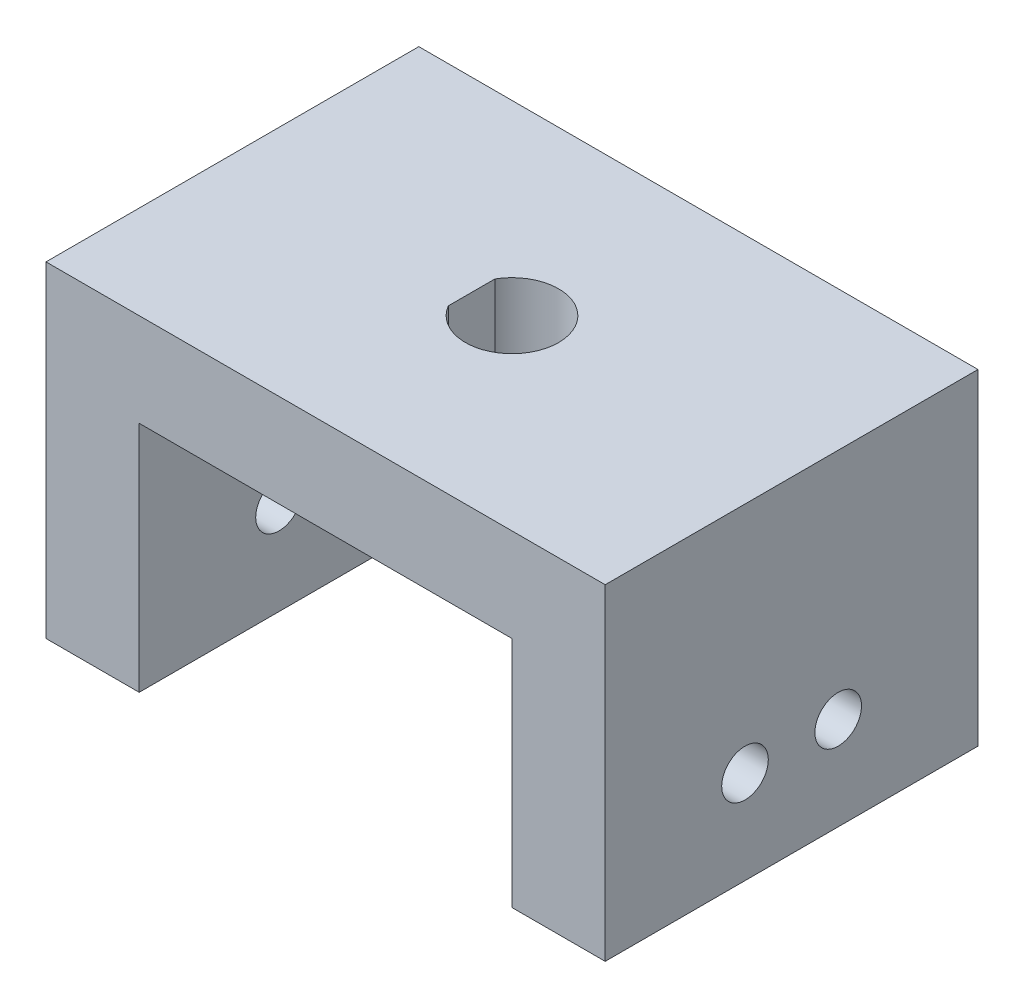
ISO-10303-21;
HEADER;
FILE_DESCRIPTION(('STEP AP214'),'2;1');
FILE_NAME('part.step','',(''),(''),'','','');
FILE_SCHEMA(('AUTOMOTIVE_DESIGN { 1 0 10303 214 1 1 1 1 }'));
ENDSEC;
DATA;
#1=APPLICATION_CONTEXT('core data for automotive mechanical design processes');
#2=APPLICATION_PROTOCOL_DEFINITION('international standard','automotive_design',2000,#1);
#3=PRODUCT_CONTEXT('',#1,'mechanical');
#4=PRODUCT('Part','Part','',(#3));
#5=PRODUCT_RELATED_PRODUCT_CATEGORY('part','',(#4));
#6=PRODUCT_DEFINITION_FORMATION('','',#4);
#7=PRODUCT_DEFINITION_CONTEXT('part definition',#1,'design');
#8=PRODUCT_DEFINITION('design','',#6,#7);
#9=PRODUCT_DEFINITION_SHAPE('','',#8);
#10=(LENGTH_UNIT() NAMED_UNIT(*) SI_UNIT(.MILLI.,.METRE.));
#11=(NAMED_UNIT(*) PLANE_ANGLE_UNIT() SI_UNIT($,.RADIAN.));
#12=(NAMED_UNIT(*) SI_UNIT($,.STERADIAN.) SOLID_ANGLE_UNIT());
#13=UNCERTAINTY_MEASURE_WITH_UNIT(LENGTH_MEASURE(1.E-05),#10,'distance_accuracy_value','');
#14=(GEOMETRIC_REPRESENTATION_CONTEXT(3) GLOBAL_UNCERTAINTY_ASSIGNED_CONTEXT((#13)) GLOBAL_UNIT_ASSIGNED_CONTEXT((#10,
#11,#12)) REPRESENTATION_CONTEXT('',''));
#15=CARTESIAN_POINT('',(0.,0.,0.));
#16=DIRECTION('',(0.,0.,1.));
#17=DIRECTION('',(1.,0.,0.));
#18=AXIS2_PLACEMENT_3D('',#15,#16,#17);
#19=CARTESIAN_POINT('',(-38.1,0.,50.8));
#20=DIRECTION('',(1.,0.,0.));
#21=DIRECTION('',(0.,1.,0.));
#22=AXIS2_PLACEMENT_3D('',#19,#20,#21);
#23=PLANE('',#22);
#24=CARTESIAN_POINT('',(-38.1,-31.75,19.05));
#25=DIRECTION('',(-1.,0.,0.));
#26=DIRECTION('',(0.,-1.,0.));
#27=AXIS2_PLACEMENT_3D('',#24,#25,#26);
#28=CIRCLE('',#27,3.175);
#29=CARTESIAN_POINT('',(-38.1,-34.925,19.05));
#30=VERTEX_POINT('',#29);
#31=EDGE_CURVE('E227',#30,#30,#28,.T.);
#32=ORIENTED_EDGE('',*,*,#31,.F.);
#33=EDGE_LOOP('',(#32));
#34=FACE_BOUND('',#33,.T.);
#35=CARTESIAN_POINT('',(-38.1,-31.75,31.75));
#36=DIRECTION('',(-1.,0.,0.));
#37=DIRECTION('',(0.,-1.,0.));
#38=AXIS2_PLACEMENT_3D('',#35,#36,#37);
#39=CIRCLE('',#38,3.175);
#40=CARTESIAN_POINT('',(-38.1,-34.925,31.75));
#41=VERTEX_POINT('',#40);
#42=EDGE_CURVE('E236',#41,#41,#39,.T.);
#43=ORIENTED_EDGE('',*,*,#42,.F.);
#44=EDGE_LOOP('',(#43));
#45=FACE_BOUND('',#44,.T.);
#46=DIRECTION('',(0.,-1.,0.));
#47=VECTOR('',#46,1.);
#48=CARTESIAN_POINT('',(-38.1,0.,0.));
#49=LINE('',#48,#47);
#50=CARTESIAN_POINT('',(-38.1,0.,0.));
#51=VERTEX_POINT('',#50);
#52=CARTESIAN_POINT('',(-38.1,-44.45,0.));
#53=VERTEX_POINT('',#52);
#54=EDGE_CURVE('E129',#51,#53,#49,.T.);
#55=ORIENTED_EDGE('',*,*,#54,.T.);
#56=DIRECTION('',(0.,0.,-1.));
#57=VECTOR('',#56,1.);
#58=CARTESIAN_POINT('',(-38.1,-44.45,50.8));
#59=LINE('',#58,#57);
#60=CARTESIAN_POINT('',(-38.1,-44.45,50.8));
#61=VERTEX_POINT('',#60);
#62=EDGE_CURVE('E11',#61,#53,#59,.T.);
#63=ORIENTED_EDGE('',*,*,#62,.F.);
#64=DIRECTION('',(0.,-1.,0.));
#65=VECTOR('',#64,1.);
#66=CARTESIAN_POINT('',(-38.1,0.,50.8));
#67=LINE('',#66,#65);
#68=CARTESIAN_POINT('',(-38.1,0.,50.8));
#69=VERTEX_POINT('',#68);
#70=EDGE_CURVE('E148',#69,#61,#67,.T.);
#71=ORIENTED_EDGE('',*,*,#70,.F.);
#72=DIRECTION('',(0.,0.,-1.));
#73=VECTOR('',#72,1.);
#74=CARTESIAN_POINT('',(-38.1,0.,50.8));
#75=LINE('',#74,#73);
#76=EDGE_CURVE('E174',#69,#51,#75,.T.);
#77=ORIENTED_EDGE('',*,*,#76,.T.);
#78=EDGE_LOOP('',(#55,#63,#71,#77));
#79=FACE_BOUND('',#78,.T.);
#80=ADVANCED_FACE('F39',(#34,#45,#79),#23,.F.);
#81=CARTESIAN_POINT('',(-38.1,-44.45,50.8));
#82=DIRECTION('',(0.,1.,0.));
#83=DIRECTION('',(0.,0.,1.));
#84=AXIS2_PLACEMENT_3D('',#81,#82,#83);
#85=PLANE('',#84);
#86=DIRECTION('',(1.,0.,0.));
#87=VECTOR('',#86,1.);
#88=CARTESIAN_POINT('',(-38.1,-44.45,0.));
#89=LINE('',#88,#87);
#90=CARTESIAN_POINT('',(-25.4,-44.45,0.));
#91=VERTEX_POINT('',#90);
#92=EDGE_CURVE('E178',#53,#91,#89,.T.);
#93=ORIENTED_EDGE('',*,*,#92,.T.);
#94=DIRECTION('',(0.,0.,-1.));
#95=VECTOR('',#94,1.);
#96=CARTESIAN_POINT('',(-25.4,-44.45,50.8));
#97=LINE('',#96,#95);
#98=CARTESIAN_POINT('',(-25.4,-44.45,50.8));
#99=VERTEX_POINT('',#98);
#100=EDGE_CURVE('E48',#99,#91,#97,.T.);
#101=ORIENTED_EDGE('',*,*,#100,.F.);
#102=DIRECTION('',(1.,0.,0.));
#103=VECTOR('',#102,1.);
#104=CARTESIAN_POINT('',(-38.1,-44.45,50.8));
#105=LINE('',#104,#103);
#106=EDGE_CURVE('E152',#61,#99,#105,.T.);
#107=ORIENTED_EDGE('',*,*,#106,.F.);
#108=ORIENTED_EDGE('',*,*,#62,.T.);
#109=EDGE_LOOP('',(#93,#101,#107,#108));
#110=FACE_BOUND('',#109,.T.);
#111=ADVANCED_FACE('F272',(#110),#85,.F.);
#112=CARTESIAN_POINT('',(-25.4,-44.45,50.8));
#113=DIRECTION('',(-1.,0.,0.));
#114=DIRECTION('',(0.,0.,1.));
#115=AXIS2_PLACEMENT_3D('',#112,#113,#114);
#116=PLANE('',#115);
#117=CARTESIAN_POINT('',(-25.4,-31.75,19.05));
#118=DIRECTION('',(-1.,0.,0.));
#119=DIRECTION('',(0.,0.,1.));
#120=AXIS2_PLACEMENT_3D('',#117,#118,#119);
#121=CIRCLE('',#120,3.175);
#122=CARTESIAN_POINT('',(-25.4,-31.75,22.225));
#123=VERTEX_POINT('',#122);
#124=EDGE_CURVE('E134',#123,#123,#121,.T.);
#125=ORIENTED_EDGE('',*,*,#124,.T.);
#126=EDGE_LOOP('',(#125));
#127=FACE_BOUND('',#126,.T.);
#128=CARTESIAN_POINT('',(-25.4,-31.75,31.75));
#129=DIRECTION('',(-1.,0.,0.));
#130=DIRECTION('',(0.,0.,1.));
#131=AXIS2_PLACEMENT_3D('',#128,#129,#130);
#132=CIRCLE('',#131,3.175);
#133=CARTESIAN_POINT('',(-25.4,-31.75,34.925));
#134=VERTEX_POINT('',#133);
#135=EDGE_CURVE('E233',#134,#134,#132,.T.);
#136=ORIENTED_EDGE('',*,*,#135,.T.);
#137=EDGE_LOOP('',(#136));
#138=FACE_BOUND('',#137,.T.);
#139=DIRECTION('',(0.,1.,0.));
#140=VECTOR('',#139,1.);
#141=CARTESIAN_POINT('',(-25.4,-44.45,0.));
#142=LINE('',#141,#140);
#143=CARTESIAN_POINT('',(-25.4,-12.7,0.));
#144=VERTEX_POINT('',#143);
#145=EDGE_CURVE('E181',#91,#144,#142,.T.);
#146=ORIENTED_EDGE('',*,*,#145,.T.);
#147=DIRECTION('',(0.,0.,-1.));
#148=VECTOR('',#147,1.);
#149=CARTESIAN_POINT('',(-25.4,-12.7,50.8));
#150=LINE('',#149,#148);
#151=CARTESIAN_POINT('',(-25.4,-12.7,50.8));
#152=VERTEX_POINT('',#151);
#153=EDGE_CURVE('E217',#152,#144,#150,.T.);
#154=ORIENTED_EDGE('',*,*,#153,.F.);
#155=DIRECTION('',(0.,1.,0.));
#156=VECTOR('',#155,1.);
#157=CARTESIAN_POINT('',(-25.4,-44.45,50.8));
#158=LINE('',#157,#156);
#159=EDGE_CURVE('E156',#99,#152,#158,.T.);
#160=ORIENTED_EDGE('',*,*,#159,.F.);
#161=ORIENTED_EDGE('',*,*,#100,.T.);
#162=EDGE_LOOP('',(#146,#154,#160,#161));
#163=FACE_BOUND('',#162,.T.);
#164=ADVANCED_FACE('F277',(#127,#138,#163),#116,.F.);
#165=CARTESIAN_POINT('',(-25.4,-12.7,50.8));
#166=DIRECTION('',(0.,1.,0.));
#167=DIRECTION('',(0.,0.,1.));
#168=AXIS2_PLACEMENT_3D('',#165,#166,#167);
#169=PLANE('',#168);
#170=CARTESIAN_POINT('',(0.,-12.7,25.4));
#171=DIRECTION('',(0.,1.,0.));
#172=DIRECTION('',(0.,0.,1.));
#173=AXIS2_PLACEMENT_3D('',#170,#171,#172);
#174=CIRCLE('',#173,6.35);
#175=CARTESIAN_POINT('',(-5.49926131403118,-12.7,22.225));
#176=VERTEX_POINT('',#175);
#177=CARTESIAN_POINT('',(-5.49926131403118,-12.7,28.575));
#178=VERTEX_POINT('',#177);
#179=EDGE_CURVE('E125',#176,#178,#174,.F.);
#180=ORIENTED_EDGE('',*,*,#179,.F.);
#181=DIRECTION('',(0.,0.,-1.));
#182=VECTOR('',#181,1.);
#183=CARTESIAN_POINT('',(-5.49926131403118,-12.7,0.));
#184=LINE('',#183,#182);
#185=EDGE_CURVE('E56',#178,#176,#184,.T.);
#186=ORIENTED_EDGE('',*,*,#185,.F.);
#187=EDGE_LOOP('',(#180,#186));
#188=FACE_BOUND('',#187,.T.);
#189=DIRECTION('',(1.,0.,0.));
#190=VECTOR('',#189,1.);
#191=CARTESIAN_POINT('',(-25.4,-12.7,0.));
#192=LINE('',#191,#190);
#193=CARTESIAN_POINT('',(25.4,-12.7,0.));
#194=VERTEX_POINT('',#193);
#195=EDGE_CURVE('E184',#144,#194,#192,.T.);
#196=ORIENTED_EDGE('',*,*,#195,.T.);
#197=DIRECTION('',(0.,0.,-1.));
#198=VECTOR('',#197,1.);
#199=CARTESIAN_POINT('',(25.4,-12.7,50.8));
#200=LINE('',#199,#198);
#201=CARTESIAN_POINT('',(25.4,-12.7,50.8));
#202=VERTEX_POINT('',#201);
#203=EDGE_CURVE('E213',#202,#194,#200,.T.);
#204=ORIENTED_EDGE('',*,*,#203,.F.);
#205=DIRECTION('',(1.,0.,0.));
#206=VECTOR('',#205,1.);
#207=CARTESIAN_POINT('',(-25.4,-12.7,50.8));
#208=LINE('',#207,#206);
#209=EDGE_CURVE('E159',#152,#202,#208,.T.);
#210=ORIENTED_EDGE('',*,*,#209,.F.);
#211=ORIENTED_EDGE('',*,*,#153,.T.);
#212=EDGE_LOOP('',(#196,#204,#210,#211));
#213=FACE_BOUND('',#212,.T.);
#214=ADVANCED_FACE('F131',(#188,#213),#169,.F.);
#215=CARTESIAN_POINT('',(25.4,-12.7,50.8));
#216=DIRECTION('',(1.,0.,0.));
#217=DIRECTION('',(0.,1.,0.));
#218=AXIS2_PLACEMENT_3D('',#215,#216,#217);
#219=PLANE('',#218);
#220=CARTESIAN_POINT('',(25.4,-31.75,19.05));
#221=DIRECTION('',(1.,0.,0.));
#222=DIRECTION('',(0.,1.,0.));
#223=AXIS2_PLACEMENT_3D('',#220,#221,#222);
#224=CIRCLE('',#223,3.175);
#225=CARTESIAN_POINT('',(25.4,-28.575,19.05));
#226=VERTEX_POINT('',#225);
#227=EDGE_CURVE('E140',#226,#226,#224,.T.);
#228=ORIENTED_EDGE('',*,*,#227,.T.);
#229=EDGE_LOOP('',(#228));
#230=FACE_BOUND('',#229,.T.);
#231=CARTESIAN_POINT('',(25.4,-31.75,31.75));
#232=DIRECTION('',(1.,0.,0.));
#233=DIRECTION('',(0.,1.,0.));
#234=AXIS2_PLACEMENT_3D('',#231,#232,#233);
#235=CIRCLE('',#234,3.175);
#236=CARTESIAN_POINT('',(25.4,-28.575,31.75));
#237=VERTEX_POINT('',#236);
#238=EDGE_CURVE('E226',#237,#237,#235,.T.);
#239=ORIENTED_EDGE('',*,*,#238,.T.);
#240=EDGE_LOOP('',(#239));
#241=FACE_BOUND('',#240,.T.);
#242=DIRECTION('',(0.,-1.,0.));
#243=VECTOR('',#242,1.);
#244=CARTESIAN_POINT('',(25.4,-12.7,0.));
#245=LINE('',#244,#243);
#246=CARTESIAN_POINT('',(25.4,-44.45,0.));
#247=VERTEX_POINT('',#246);
#248=EDGE_CURVE('E187',#194,#247,#245,.T.);
#249=ORIENTED_EDGE('',*,*,#248,.T.);
#250=DIRECTION('',(0.,0.,-1.));
#251=VECTOR('',#250,1.);
#252=CARTESIAN_POINT('',(25.4,-44.45,50.8));
#253=LINE('',#252,#251);
#254=CARTESIAN_POINT('',(25.4,-44.45,50.8));
#255=VERTEX_POINT('',#254);
#256=EDGE_CURVE('E209',#255,#247,#253,.T.);
#257=ORIENTED_EDGE('',*,*,#256,.F.);
#258=DIRECTION('',(0.,-1.,0.));
#259=VECTOR('',#258,1.);
#260=CARTESIAN_POINT('',(25.4,-12.7,50.8));
#261=LINE('',#260,#259);
#262=EDGE_CURVE('E162',#202,#255,#261,.T.);
#263=ORIENTED_EDGE('',*,*,#262,.F.);
#264=ORIENTED_EDGE('',*,*,#203,.T.);
#265=EDGE_LOOP('',(#249,#257,#263,#264));
#266=FACE_BOUND('',#265,.T.);
#267=ADVANCED_FACE('F311',(#230,#241,#266),#219,.F.);
#268=CARTESIAN_POINT('',(25.4,-44.45,50.8));
#269=DIRECTION('',(0.,1.,0.));
#270=DIRECTION('',(0.,0.,1.));
#271=AXIS2_PLACEMENT_3D('',#268,#269,#270);
#272=PLANE('',#271);
#273=DIRECTION('',(1.,0.,0.));
#274=VECTOR('',#273,1.);
#275=CARTESIAN_POINT('',(25.4,-44.45,0.));
#276=LINE('',#275,#274);
#277=CARTESIAN_POINT('',(38.1,-44.45,0.));
#278=VERTEX_POINT('',#277);
#279=EDGE_CURVE('E190',#247,#278,#276,.T.);
#280=ORIENTED_EDGE('',*,*,#279,.T.);
#281=DIRECTION('',(0.,0.,-1.));
#282=VECTOR('',#281,1.);
#283=CARTESIAN_POINT('',(38.1,-44.45,50.8));
#284=LINE('',#283,#282);
#285=CARTESIAN_POINT('',(38.1,-44.45,50.8));
#286=VERTEX_POINT('',#285);
#287=EDGE_CURVE('E205',#286,#278,#284,.T.);
#288=ORIENTED_EDGE('',*,*,#287,.F.);
#289=DIRECTION('',(1.,0.,0.));
#290=VECTOR('',#289,1.);
#291=CARTESIAN_POINT('',(25.4,-44.45,50.8));
#292=LINE('',#291,#290);
#293=EDGE_CURVE('E165',#255,#286,#292,.T.);
#294=ORIENTED_EDGE('',*,*,#293,.F.);
#295=ORIENTED_EDGE('',*,*,#256,.T.);
#296=EDGE_LOOP('',(#280,#288,#294,#295));
#297=FACE_BOUND('',#296,.T.);
#298=ADVANCED_FACE('F306',(#297),#272,.F.);
#299=CARTESIAN_POINT('',(38.1,0.,50.8));
#300=DIRECTION('',(-1.,0.,0.));
#301=DIRECTION('',(0.,-1.,0.));
#302=AXIS2_PLACEMENT_3D('',#299,#300,#301);
#303=PLANE('',#302);
#304=CARTESIAN_POINT('',(38.1,-31.75,19.05));
#305=DIRECTION('',(-1.,0.,0.));
#306=DIRECTION('',(0.,-1.,0.));
#307=AXIS2_PLACEMENT_3D('',#304,#305,#306);
#308=CIRCLE('',#307,3.175);
#309=CARTESIAN_POINT('',(38.1,-34.925,19.05));
#310=VERTEX_POINT('',#309);
#311=EDGE_CURVE('E42',#310,#310,#308,.T.);
#312=ORIENTED_EDGE('',*,*,#311,.T.);
#313=EDGE_LOOP('',(#312));
#314=FACE_BOUND('',#313,.T.);
#315=CARTESIAN_POINT('',(38.1,-31.75,31.75));
#316=DIRECTION('',(-1.,0.,0.));
#317=DIRECTION('',(0.,-1.,0.));
#318=AXIS2_PLACEMENT_3D('',#315,#316,#317);
#319=CIRCLE('',#318,3.175);
#320=CARTESIAN_POINT('',(38.1,-34.925,31.75));
#321=VERTEX_POINT('',#320);
#322=EDGE_CURVE('E223',#321,#321,#319,.T.);
#323=ORIENTED_EDGE('',*,*,#322,.T.);
#324=EDGE_LOOP('',(#323));
#325=FACE_BOUND('',#324,.T.);
#326=DIRECTION('',(0.,1.,0.));
#327=VECTOR('',#326,1.);
#328=CARTESIAN_POINT('',(38.1,0.,0.));
#329=LINE('',#328,#327);
#330=CARTESIAN_POINT('',(38.1,0.,0.));
#331=VERTEX_POINT('',#330);
#332=EDGE_CURVE('E193',#278,#331,#329,.T.);
#333=ORIENTED_EDGE('',*,*,#332,.T.);
#334=DIRECTION('',(0.,0.,-1.));
#335=VECTOR('',#334,1.);
#336=CARTESIAN_POINT('',(38.1,0.,50.8));
#337=LINE('',#336,#335);
#338=CARTESIAN_POINT('',(38.1,0.,50.8));
#339=VERTEX_POINT('',#338);
#340=EDGE_CURVE('E201',#339,#331,#337,.T.);
#341=ORIENTED_EDGE('',*,*,#340,.F.);
#342=DIRECTION('',(0.,1.,0.));
#343=VECTOR('',#342,1.);
#344=CARTESIAN_POINT('',(38.1,0.,50.8));
#345=LINE('',#344,#343);
#346=EDGE_CURVE('E168',#286,#339,#345,.T.);
#347=ORIENTED_EDGE('',*,*,#346,.F.);
#348=ORIENTED_EDGE('',*,*,#287,.T.);
#349=EDGE_LOOP('',(#333,#341,#347,#348));
#350=FACE_BOUND('',#349,.T.);
#351=ADVANCED_FACE('F254',(#314,#325,#350),#303,.F.);
#352=CARTESIAN_POINT('',(38.1,0.,50.8));
#353=DIRECTION('',(0.,-1.,0.));
#354=DIRECTION('',(0.,0.,-1.));
#355=AXIS2_PLACEMENT_3D('',#352,#353,#354);
#356=PLANE('',#355);
#357=CARTESIAN_POINT('',(0.,0.,25.4));
#358=DIRECTION('',(0.,1.,0.));
#359=DIRECTION('',(0.,0.,1.));
#360=AXIS2_PLACEMENT_3D('',#357,#358,#359);
#361=CIRCLE('',#360,6.35);
#362=CARTESIAN_POINT('',(-5.49926131403118,0.,28.575));
#363=VERTEX_POINT('',#362);
#364=CARTESIAN_POINT('',(-5.49926131403118,0.,22.225));
#365=VERTEX_POINT('',#364);
#366=EDGE_CURVE('E122',#363,#365,#361,.T.);
#367=ORIENTED_EDGE('',*,*,#366,.F.);
#368=DIRECTION('',(0.,0.,1.));
#369=VECTOR('',#368,1.);
#370=CARTESIAN_POINT('',(-5.49926131403118,0.,0.));
#371=LINE('',#370,#369);
#372=EDGE_CURVE('E61',#365,#363,#371,.T.);
#373=ORIENTED_EDGE('',*,*,#372,.F.);
#374=EDGE_LOOP('',(#367,#373));
#375=FACE_BOUND('',#374,.T.);
#376=DIRECTION('',(-1.,0.,0.));
#377=VECTOR('',#376,1.);
#378=CARTESIAN_POINT('',(38.1,0.,0.));
#379=LINE('',#378,#377);
#380=EDGE_CURVE('E153',#331,#51,#379,.T.);
#381=ORIENTED_EDGE('',*,*,#380,.T.);
#382=ORIENTED_EDGE('',*,*,#76,.F.);
#383=DIRECTION('',(-1.,0.,0.));
#384=VECTOR('',#383,1.);
#385=CARTESIAN_POINT('',(38.1,0.,50.8));
#386=LINE('',#385,#384);
#387=EDGE_CURVE('E171',#339,#69,#386,.T.);
#388=ORIENTED_EDGE('',*,*,#387,.F.);
#389=ORIENTED_EDGE('',*,*,#340,.T.);
#390=EDGE_LOOP('',(#381,#382,#388,#389));
#391=FACE_BOUND('',#390,.T.);
#392=ADVANCED_FACE('F300',(#375,#391),#356,.F.);
#393=CARTESIAN_POINT('',(0.,0.,50.8));
#394=DIRECTION('',(0.,0.,1.));
#395=DIRECTION('',(1.,0.,0.));
#396=AXIS2_PLACEMENT_3D('',#393,#394,#395);
#397=PLANE('',#396);
#398=ORIENTED_EDGE('',*,*,#70,.T.);
#399=ORIENTED_EDGE('',*,*,#106,.T.);
#400=ORIENTED_EDGE('',*,*,#159,.T.);
#401=ORIENTED_EDGE('',*,*,#209,.T.);
#402=ORIENTED_EDGE('',*,*,#262,.T.);
#403=ORIENTED_EDGE('',*,*,#293,.T.);
#404=ORIENTED_EDGE('',*,*,#346,.T.);
#405=ORIENTED_EDGE('',*,*,#387,.T.);
#406=EDGE_LOOP('',(#398,#399,#400,#401,#402,#403,#404,#405));
#407=FACE_BOUND('',#406,.T.);
#408=ADVANCED_FACE('F295',(#407),#397,.T.);
#409=CARTESIAN_POINT('',(0.,0.,0.));
#410=DIRECTION('',(0.,0.,1.));
#411=DIRECTION('',(1.,0.,0.));
#412=AXIS2_PLACEMENT_3D('',#409,#410,#411);
#413=PLANE('',#412);
#414=ORIENTED_EDGE('',*,*,#54,.F.);
#415=ORIENTED_EDGE('',*,*,#380,.F.);
#416=ORIENTED_EDGE('',*,*,#332,.F.);
#417=ORIENTED_EDGE('',*,*,#279,.F.);
#418=ORIENTED_EDGE('',*,*,#248,.F.);
#419=ORIENTED_EDGE('',*,*,#195,.F.);
#420=ORIENTED_EDGE('',*,*,#145,.F.);
#421=ORIENTED_EDGE('',*,*,#92,.F.);
#422=EDGE_LOOP('',(#414,#415,#416,#417,#418,#419,#420,#421));
#423=FACE_BOUND('',#422,.T.);
#424=ADVANCED_FACE('F288',(#423),#413,.F.);
#425=CARTESIAN_POINT('',(-5.49926131403118,-44.451,0.));
#426=DIRECTION('',(-1.,0.,0.));
#427=DIRECTION('',(0.,0.,1.));
#428=AXIS2_PLACEMENT_3D('',#425,#426,#427);
#429=PLANE('',#428);
#430=ORIENTED_EDGE('',*,*,#185,.T.);
#431=DIRECTION('',(0.,1.,0.));
#432=VECTOR('',#431,1.);
#433=CARTESIAN_POINT('',(-5.49926131403118,-44.451,22.225));
#434=LINE('',#433,#432);
#435=EDGE_CURVE('E121',#176,#365,#434,.T.);
#436=ORIENTED_EDGE('',*,*,#435,.T.);
#437=ORIENTED_EDGE('',*,*,#372,.T.);
#438=DIRECTION('',(0.,1.,0.));
#439=VECTOR('',#438,1.);
#440=CARTESIAN_POINT('',(-5.49926131403118,-44.451,28.575));
#441=LINE('',#440,#439);
#442=EDGE_CURVE('E114',#178,#363,#441,.T.);
#443=ORIENTED_EDGE('',*,*,#442,.F.);
#444=EDGE_LOOP('',(#430,#436,#437,#443));
#445=FACE_BOUND('',#444,.T.);
#446=ADVANCED_FACE('F116',(#445),#429,.F.);
#447=CARTESIAN_POINT('',(0.,-44.451,25.4));
#448=DIRECTION('',(0.,1.,0.));
#449=DIRECTION('',(0.,0.,1.));
#450=AXIS2_PLACEMENT_3D('',#447,#448,#449);
#451=CYLINDRICAL_SURFACE('',#450,6.35);
#452=ORIENTED_EDGE('',*,*,#179,.T.);
#453=ORIENTED_EDGE('',*,*,#442,.T.);
#454=ORIENTED_EDGE('',*,*,#366,.T.);
#455=ORIENTED_EDGE('',*,*,#435,.F.);
#456=EDGE_LOOP('',(#452,#453,#454,#455));
#457=FACE_BOUND('',#456,.T.);
#458=ADVANCED_FACE('F126',(#457),#451,.F.);
#459=CARTESIAN_POINT('',(45.7,-31.75,31.75));
#460=DIRECTION('',(-1.,0.,0.));
#461=DIRECTION('',(0.,-1.,0.));
#462=AXIS2_PLACEMENT_3D('',#459,#460,#461);
#463=CYLINDRICAL_SURFACE('',#462,3.175);
#464=ORIENTED_EDGE('',*,*,#322,.F.);
#465=EDGE_LOOP('',(#464));
#466=FACE_BOUND('',#465,.T.);
#467=ORIENTED_EDGE('',*,*,#238,.F.);
#468=EDGE_LOOP('',(#467));
#469=FACE_BOUND('',#468,.T.);
#470=ADVANCED_FACE('F260',(#466,#469),#463,.F.);
#471=CARTESIAN_POINT('',(45.7,-31.75,19.05));
#472=DIRECTION('',(-1.,0.,0.));
#473=DIRECTION('',(0.,-1.,0.));
#474=AXIS2_PLACEMENT_3D('',#471,#472,#473);
#475=CYLINDRICAL_SURFACE('',#474,3.175);
#476=ORIENTED_EDGE('',*,*,#311,.F.);
#477=EDGE_LOOP('',(#476));
#478=FACE_BOUND('',#477,.T.);
#479=ORIENTED_EDGE('',*,*,#227,.F.);
#480=EDGE_LOOP('',(#479));
#481=FACE_BOUND('',#480,.T.);
#482=ADVANCED_FACE('F256',(#478,#481),#475,.F.);
#483=ORIENTED_EDGE('',*,*,#42,.T.);
#484=EDGE_LOOP('',(#483));
#485=FACE_BOUND('',#484,.T.);
#486=ORIENTED_EDGE('',*,*,#135,.F.);
#487=EDGE_LOOP('',(#486));
#488=FACE_BOUND('',#487,.T.);
#489=ADVANCED_FACE('F259',(#485,#488),#463,.F.);
#490=ORIENTED_EDGE('',*,*,#31,.T.);
#491=EDGE_LOOP('',(#490));
#492=FACE_BOUND('',#491,.T.);
#493=ORIENTED_EDGE('',*,*,#124,.F.);
#494=EDGE_LOOP('',(#493));
#495=FACE_BOUND('',#494,.T.);
#496=ADVANCED_FACE('F262',(#492,#495),#475,.F.);
#497=CLOSED_SHELL('',(#80,#111,#164,#214,#267,#298,#351,#392,#408,#424,#446,#458,#470,#482,#489,#496));
#498=MANIFOLD_SOLID_BREP('B2',#497);
#499=ADVANCED_BREP_SHAPE_REPRESENTATION('',(#18,#498),#14);
#500=SHAPE_DEFINITION_REPRESENTATION(#9,#499);
ENDSEC;
END-ISO-10303-21;
